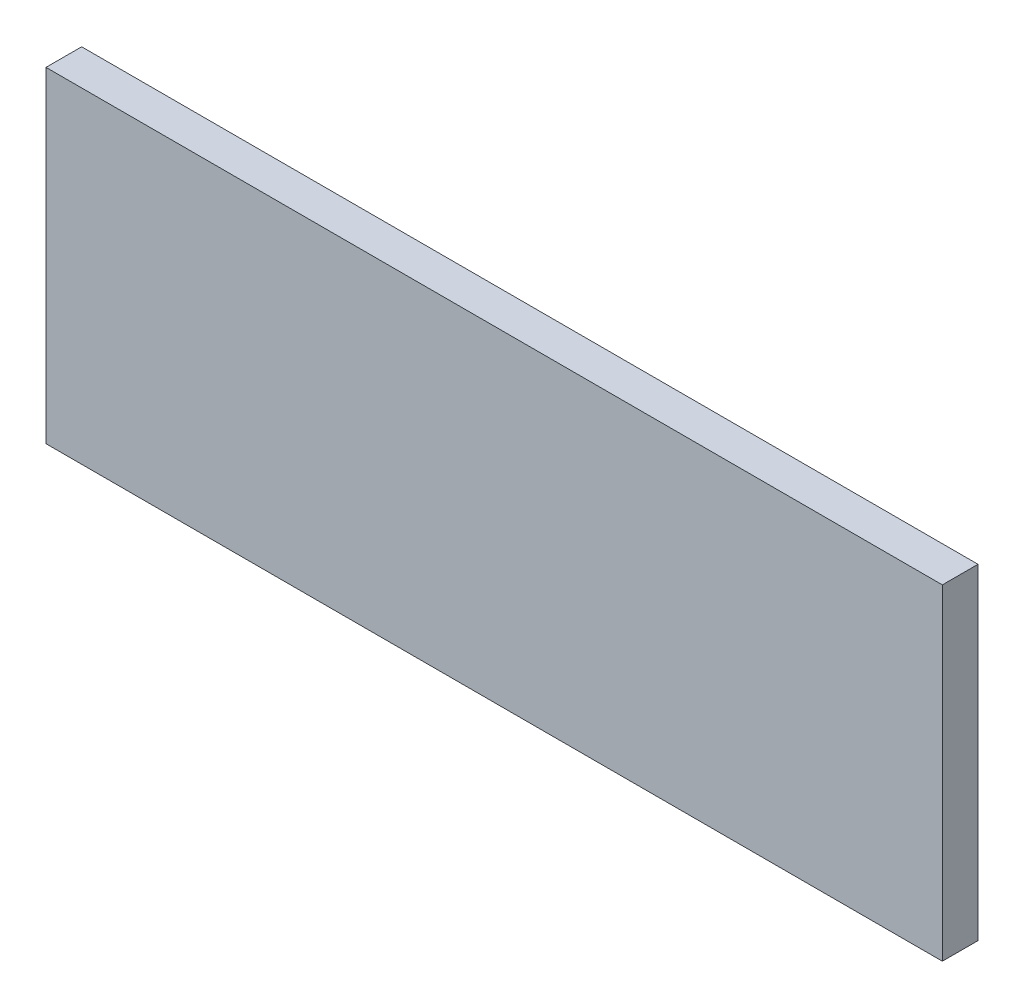
ISO-10303-21;
HEADER;
FILE_DESCRIPTION(('STEP AP214'),'2;1');
FILE_NAME('part.step','',(''),(''),'','','');
FILE_SCHEMA(('AUTOMOTIVE_DESIGN { 1 0 10303 214 1 1 1 1 }'));
ENDSEC;
DATA;
#1=APPLICATION_CONTEXT('core data for automotive mechanical design processes');
#2=APPLICATION_PROTOCOL_DEFINITION('international standard','automotive_design',2000,#1);
#3=PRODUCT_CONTEXT('',#1,'mechanical');
#4=PRODUCT('Part','Part','',(#3));
#5=PRODUCT_RELATED_PRODUCT_CATEGORY('part','',(#4));
#6=PRODUCT_DEFINITION_FORMATION('','',#4);
#7=PRODUCT_DEFINITION_CONTEXT('part definition',#1,'design');
#8=PRODUCT_DEFINITION('design','',#6,#7);
#9=PRODUCT_DEFINITION_SHAPE('','',#8);
#10=(LENGTH_UNIT() NAMED_UNIT(*) SI_UNIT(.MILLI.,.METRE.));
#11=(NAMED_UNIT(*) PLANE_ANGLE_UNIT() SI_UNIT($,.RADIAN.));
#12=(NAMED_UNIT(*) SI_UNIT($,.STERADIAN.) SOLID_ANGLE_UNIT());
#13=UNCERTAINTY_MEASURE_WITH_UNIT(LENGTH_MEASURE(1.E-05),#10,'distance_accuracy_value','');
#14=(GEOMETRIC_REPRESENTATION_CONTEXT(3) GLOBAL_UNCERTAINTY_ASSIGNED_CONTEXT((#13)) GLOBAL_UNIT_ASSIGNED_CONTEXT((#10,
#11,#12)) REPRESENTATION_CONTEXT('',''));
#15=CARTESIAN_POINT('',(0.,0.,0.));
#16=DIRECTION('',(0.,0.,1.));
#17=DIRECTION('',(1.,0.,0.));
#18=AXIS2_PLACEMENT_3D('',#15,#16,#17);
#19=CARTESIAN_POINT('',(69.85,-25.4,5.55625));
#20=DIRECTION('',(-1.,0.,0.));
#21=DIRECTION('',(0.,0.,1.));
#22=AXIS2_PLACEMENT_3D('',#19,#20,#21);
#23=PLANE('',#22);
#24=DIRECTION('',(0.,1.,0.));
#25=VECTOR('',#24,1.);
#26=CARTESIAN_POINT('',(69.85,-25.4,0.));
#27=LINE('',#26,#25);
#28=CARTESIAN_POINT('',(69.85,-25.4,0.));
#29=VERTEX_POINT('',#28);
#30=CARTESIAN_POINT('',(69.85,25.4,0.));
#31=VERTEX_POINT('',#30);
#32=EDGE_CURVE('E113',#29,#31,#27,.T.);
#33=ORIENTED_EDGE('',*,*,#32,.T.);
#34=DIRECTION('',(0.,0.,-1.));
#35=VECTOR('',#34,1.);
#36=CARTESIAN_POINT('',(69.85,25.4,5.55625));
#37=LINE('',#36,#35);
#38=CARTESIAN_POINT('',(69.85,25.4,5.55625));
#39=VERTEX_POINT('',#38);
#40=EDGE_CURVE('E11',#39,#31,#37,.T.);
#41=ORIENTED_EDGE('',*,*,#40,.F.);
#42=DIRECTION('',(0.,1.,0.));
#43=VECTOR('',#42,1.);
#44=CARTESIAN_POINT('',(69.85,-25.4,5.55625));
#45=LINE('',#44,#43);
#46=CARTESIAN_POINT('',(69.85,-25.4,5.55625));
#47=VERTEX_POINT('',#46);
#48=EDGE_CURVE('E97',#47,#39,#45,.T.);
#49=ORIENTED_EDGE('',*,*,#48,.F.);
#50=DIRECTION('',(0.,0.,-1.));
#51=VECTOR('',#50,1.);
#52=CARTESIAN_POINT('',(69.85,-25.4,5.55625));
#53=LINE('',#52,#51);
#54=EDGE_CURVE('E109',#47,#29,#53,.T.);
#55=ORIENTED_EDGE('',*,*,#54,.T.);
#56=EDGE_LOOP('',(#33,#41,#49,#55));
#57=FACE_BOUND('',#56,.T.);
#58=ADVANCED_FACE('F45',(#57),#23,.F.);
#59=CARTESIAN_POINT('',(-69.85,25.4,5.55625));
#60=DIRECTION('',(0.,-1.,0.));
#61=DIRECTION('',(0.,0.,-1.));
#62=AXIS2_PLACEMENT_3D('',#59,#60,#61);
#63=PLANE('',#62);
#64=DIRECTION('',(-1.,0.,0.));
#65=VECTOR('',#64,1.);
#66=CARTESIAN_POINT('',(-69.85,25.4,0.));
#67=LINE('',#66,#65);
#68=CARTESIAN_POINT('',(-69.85,25.4,0.));
#69=VERTEX_POINT('',#68);
#70=EDGE_CURVE('E102',#31,#69,#67,.T.);
#71=ORIENTED_EDGE('',*,*,#70,.T.);
#72=DIRECTION('',(0.,0.,-1.));
#73=VECTOR('',#72,1.);
#74=CARTESIAN_POINT('',(-69.85,25.4,5.55625));
#75=LINE('',#74,#73);
#76=CARTESIAN_POINT('',(-69.85,25.4,5.55625));
#77=VERTEX_POINT('',#76);
#78=EDGE_CURVE('E54',#77,#69,#75,.T.);
#79=ORIENTED_EDGE('',*,*,#78,.F.);
#80=DIRECTION('',(-1.,0.,0.));
#81=VECTOR('',#80,1.);
#82=CARTESIAN_POINT('',(-69.85,25.4,5.55625));
#83=LINE('',#82,#81);
#84=EDGE_CURVE('E92',#39,#77,#83,.T.);
#85=ORIENTED_EDGE('',*,*,#84,.F.);
#86=ORIENTED_EDGE('',*,*,#40,.T.);
#87=EDGE_LOOP('',(#71,#79,#85,#86));
#88=FACE_BOUND('',#87,.T.);
#89=ADVANCED_FACE('F101',(#88),#63,.F.);
#90=CARTESIAN_POINT('',(-69.85,-25.4,5.55625));
#91=DIRECTION('',(1.,0.,0.));
#92=DIRECTION('',(0.,0.,-1.));
#93=AXIS2_PLACEMENT_3D('',#90,#91,#92);
#94=PLANE('',#93);
#95=DIRECTION('',(0.,-1.,0.));
#96=VECTOR('',#95,1.);
#97=CARTESIAN_POINT('',(-69.85,-25.4,0.));
#98=LINE('',#97,#96);
#99=CARTESIAN_POINT('',(-69.85,-25.4,0.));
#100=VERTEX_POINT('',#99);
#101=EDGE_CURVE('E79',#69,#100,#98,.T.);
#102=ORIENTED_EDGE('',*,*,#101,.T.);
#103=DIRECTION('',(0.,0.,-1.));
#104=VECTOR('',#103,1.);
#105=CARTESIAN_POINT('',(-69.85,-25.4,5.55625));
#106=LINE('',#105,#104);
#107=CARTESIAN_POINT('',(-69.85,-25.4,5.55625));
#108=VERTEX_POINT('',#107);
#109=EDGE_CURVE('E104',#108,#100,#106,.T.);
#110=ORIENTED_EDGE('',*,*,#109,.F.);
#111=DIRECTION('',(0.,-1.,0.));
#112=VECTOR('',#111,1.);
#113=CARTESIAN_POINT('',(-69.85,-25.4,5.55625));
#114=LINE('',#113,#112);
#115=EDGE_CURVE('E95',#77,#108,#114,.T.);
#116=ORIENTED_EDGE('',*,*,#115,.F.);
#117=ORIENTED_EDGE('',*,*,#78,.T.);
#118=EDGE_LOOP('',(#102,#110,#116,#117));
#119=FACE_BOUND('',#118,.T.);
#120=ADVANCED_FACE('F105',(#119),#94,.F.);
#121=CARTESIAN_POINT('',(-69.85,-25.4,5.55625));
#122=DIRECTION('',(0.,1.,0.));
#123=DIRECTION('',(0.,0.,1.));
#124=AXIS2_PLACEMENT_3D('',#121,#122,#123);
#125=PLANE('',#124);
#126=DIRECTION('',(1.,0.,0.));
#127=VECTOR('',#126,1.);
#128=CARTESIAN_POINT('',(-69.85,-25.4,0.));
#129=LINE('',#128,#127);
#130=EDGE_CURVE('E85',#100,#29,#129,.T.);
#131=ORIENTED_EDGE('',*,*,#130,.T.);
#132=ORIENTED_EDGE('',*,*,#54,.F.);
#133=DIRECTION('',(1.,0.,0.));
#134=VECTOR('',#133,1.);
#135=CARTESIAN_POINT('',(-69.85,-25.4,5.55625));
#136=LINE('',#135,#134);
#137=EDGE_CURVE('E62',#108,#47,#136,.T.);
#138=ORIENTED_EDGE('',*,*,#137,.F.);
#139=ORIENTED_EDGE('',*,*,#109,.T.);
#140=EDGE_LOOP('',(#131,#132,#138,#139));
#141=FACE_BOUND('',#140,.T.);
#142=ADVANCED_FACE('F126',(#141),#125,.F.);
#143=CARTESIAN_POINT('',(0.,0.,5.55625));
#144=DIRECTION('',(0.,0.,-1.));
#145=DIRECTION('',(-1.,0.,0.));
#146=AXIS2_PLACEMENT_3D('',#143,#144,#145);
#147=PLANE('',#146);
#148=ORIENTED_EDGE('',*,*,#48,.T.);
#149=ORIENTED_EDGE('',*,*,#84,.T.);
#150=ORIENTED_EDGE('',*,*,#115,.T.);
#151=ORIENTED_EDGE('',*,*,#137,.T.);
#152=EDGE_LOOP('',(#148,#149,#150,#151));
#153=FACE_BOUND('',#152,.T.);
#154=ADVANCED_FACE('F93',(#153),#147,.F.);
#155=CARTESIAN_POINT('',(0.,0.,0.));
#156=DIRECTION('',(0.,0.,-1.));
#157=DIRECTION('',(-1.,0.,0.));
#158=AXIS2_PLACEMENT_3D('',#155,#156,#157);
#159=PLANE('',#158);
#160=ORIENTED_EDGE('',*,*,#32,.F.);
#161=ORIENTED_EDGE('',*,*,#130,.F.);
#162=ORIENTED_EDGE('',*,*,#101,.F.);
#163=ORIENTED_EDGE('',*,*,#70,.F.);
#164=EDGE_LOOP('',(#160,#161,#162,#163));
#165=FACE_BOUND('',#164,.T.);
#166=ADVANCED_FACE('F129',(#165),#159,.T.);
#167=CLOSED_SHELL('',(#58,#89,#120,#142,#154,#166));
#168=MANIFOLD_SOLID_BREP('B2',#167);
#169=ADVANCED_BREP_SHAPE_REPRESENTATION('',(#18,#168),#14);
#170=SHAPE_DEFINITION_REPRESENTATION(#9,#169);
ENDSEC;
END-ISO-10303-21;
